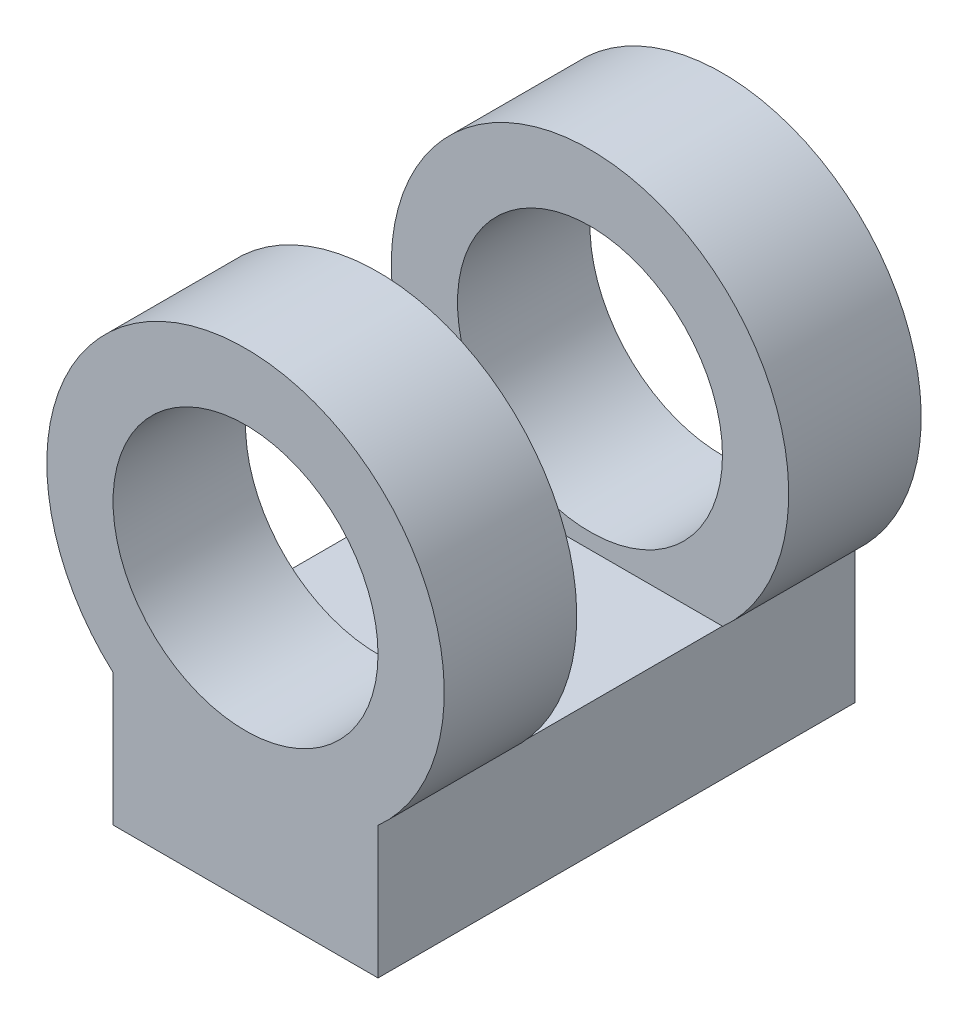
ISO-10303-21;
HEADER;
FILE_DESCRIPTION(('STEP AP214'),'2;1');
FILE_NAME('part.step','',(''),(''),'','','');
FILE_SCHEMA(('AUTOMOTIVE_DESIGN { 1 0 10303 214 1 1 1 1 }'));
ENDSEC;
DATA;
#1=APPLICATION_CONTEXT('core data for automotive mechanical design processes');
#2=APPLICATION_PROTOCOL_DEFINITION('international standard','automotive_design',2000,#1);
#3=PRODUCT_CONTEXT('',#1,'mechanical');
#4=PRODUCT('Part','Part','',(#3));
#5=PRODUCT_RELATED_PRODUCT_CATEGORY('part','',(#4));
#6=PRODUCT_DEFINITION_FORMATION('','',#4);
#7=PRODUCT_DEFINITION_CONTEXT('part definition',#1,'design');
#8=PRODUCT_DEFINITION('design','',#6,#7);
#9=PRODUCT_DEFINITION_SHAPE('','',#8);
#10=(LENGTH_UNIT() NAMED_UNIT(*) SI_UNIT(.MILLI.,.METRE.));
#11=(NAMED_UNIT(*) PLANE_ANGLE_UNIT() SI_UNIT($,.RADIAN.));
#12=(NAMED_UNIT(*) SI_UNIT($,.STERADIAN.) SOLID_ANGLE_UNIT());
#13=UNCERTAINTY_MEASURE_WITH_UNIT(LENGTH_MEASURE(1.E-05),#10,'distance_accuracy_value','');
#14=(GEOMETRIC_REPRESENTATION_CONTEXT(3) GLOBAL_UNCERTAINTY_ASSIGNED_CONTEXT((#13)) GLOBAL_UNIT_ASSIGNED_CONTEXT((#10,
#11,#12)) REPRESENTATION_CONTEXT('',''));
#15=CARTESIAN_POINT('',(0.,0.,0.));
#16=DIRECTION('',(0.,0.,1.));
#17=DIRECTION('',(1.,0.,0.));
#18=AXIS2_PLACEMENT_3D('',#15,#16,#17);
#19=CARTESIAN_POINT('',(0.,25.,0.));
#20=DIRECTION('',(0.,1.,0.));
#21=DIRECTION('',(0.,0.,1.));
#22=AXIS2_PLACEMENT_3D('',#19,#20,#21);
#23=PLANE('',#22);
#24=DIRECTION('',(1.,0.,0.));
#25=VECTOR('',#24,1.);
#26=CARTESIAN_POINT('',(0.,25.,-20.));
#27=LINE('',#26,#25);
#28=CARTESIAN_POINT('',(-25.,25.,-20.));
#29=VERTEX_POINT('',#28);
#30=CARTESIAN_POINT('',(25.,25.,-20.));
#31=VERTEX_POINT('',#30);
#32=EDGE_CURVE('E59',#29,#31,#27,.T.);
#33=ORIENTED_EDGE('',*,*,#32,.F.);
#34=DIRECTION('',(0.,0.,1.));
#35=VECTOR('',#34,1.);
#36=CARTESIAN_POINT('',(-25.,25.,-45.));
#37=LINE('',#36,#35);
#38=CARTESIAN_POINT('',(-25.,25.,20.));
#39=VERTEX_POINT('',#38);
#40=EDGE_CURVE('E148',#29,#39,#37,.T.);
#41=ORIENTED_EDGE('',*,*,#40,.T.);
#42=DIRECTION('',(1.,0.,0.));
#43=VECTOR('',#42,1.);
#44=CARTESIAN_POINT('',(0.,25.,20.));
#45=LINE('',#44,#43);
#46=CARTESIAN_POINT('',(25.,25.,20.));
#47=VERTEX_POINT('',#46);
#48=EDGE_CURVE('E170',#39,#47,#45,.T.);
#49=ORIENTED_EDGE('',*,*,#48,.T.);
#50=DIRECTION('',(0.,0.,1.));
#51=VECTOR('',#50,1.);
#52=CARTESIAN_POINT('',(25.,25.,-45.));
#53=LINE('',#52,#51);
#54=EDGE_CURVE('E150',#31,#47,#53,.T.);
#55=ORIENTED_EDGE('',*,*,#54,.F.);
#56=EDGE_LOOP('',(#33,#41,#49,#55));
#57=FACE_BOUND('',#56,.T.);
#58=ADVANCED_FACE('F36',(#57),#23,.T.);
#59=CARTESIAN_POINT('',(-25.,25.,-45.));
#60=DIRECTION('',(1.,0.,0.));
#61=DIRECTION('',(0.,0.,-1.));
#62=AXIS2_PLACEMENT_3D('',#59,#60,#61);
#63=PLANE('',#62);
#64=DIRECTION('',(0.,-1.,0.));
#65=VECTOR('',#64,1.);
#66=CARTESIAN_POINT('',(-25.,25.,-20.));
#67=LINE('',#66,#65);
#68=CARTESIAN_POINT('',(-25.,24.9491502812526,-20.));
#69=VERTEX_POINT('',#68);
#70=EDGE_CURVE('E51',#29,#69,#67,.T.);
#71=ORIENTED_EDGE('',*,*,#70,.T.);
#72=DIRECTION('',(0.,0.,1.));
#73=VECTOR('',#72,1.);
#74=CARTESIAN_POINT('',(-25.,24.9491502812526,-45.));
#75=LINE('',#74,#73);
#76=CARTESIAN_POINT('',(-25.,24.9491502812526,-45.));
#77=VERTEX_POINT('',#76);
#78=EDGE_CURVE('E109',#69,#77,#75,.F.);
#79=ORIENTED_EDGE('',*,*,#78,.T.);
#80=DIRECTION('',(0.,-1.,0.));
#81=VECTOR('',#80,1.);
#82=CARTESIAN_POINT('',(-25.,25.,-45.));
#83=LINE('',#82,#81);
#84=CARTESIAN_POINT('',(-25.,0.,-45.));
#85=VERTEX_POINT('',#84);
#86=EDGE_CURVE('E153',#77,#85,#83,.T.);
#87=ORIENTED_EDGE('',*,*,#86,.T.);
#88=DIRECTION('',(0.,0.,1.));
#89=VECTOR('',#88,1.);
#90=CARTESIAN_POINT('',(-25.,0.,-45.));
#91=LINE('',#90,#89);
#92=CARTESIAN_POINT('',(-25.,0.,45.));
#93=VERTEX_POINT('',#92);
#94=EDGE_CURVE('E147',#85,#93,#91,.T.);
#95=ORIENTED_EDGE('',*,*,#94,.T.);
#96=DIRECTION('',(0.,-1.,0.));
#97=VECTOR('',#96,1.);
#98=CARTESIAN_POINT('',(-25.,25.,45.));
#99=LINE('',#98,#97);
#100=CARTESIAN_POINT('',(-25.,24.9491502812526,45.));
#101=VERTEX_POINT('',#100);
#102=EDGE_CURVE('E168',#101,#93,#99,.T.);
#103=ORIENTED_EDGE('',*,*,#102,.F.);
#104=DIRECTION('',(0.,0.,1.));
#105=VECTOR('',#104,1.);
#106=CARTESIAN_POINT('',(-25.,24.9491502812526,20.));
#107=LINE('',#106,#105);
#108=CARTESIAN_POINT('',(-25.,24.9491502812526,20.));
#109=VERTEX_POINT('',#108);
#110=EDGE_CURVE('E145',#101,#109,#107,.F.);
#111=ORIENTED_EDGE('',*,*,#110,.T.);
#112=DIRECTION('',(0.,-1.,0.));
#113=VECTOR('',#112,1.);
#114=CARTESIAN_POINT('',(-25.,25.,20.));
#115=LINE('',#114,#113);
#116=EDGE_CURVE('E142',#39,#109,#115,.T.);
#117=ORIENTED_EDGE('',*,*,#116,.F.);
#118=ORIENTED_EDGE('',*,*,#40,.F.);
#119=EDGE_LOOP('',(#71,#79,#87,#95,#103,#111,#117,#118));
#120=FACE_BOUND('',#119,.T.);
#121=ADVANCED_FACE('F38',(#120),#63,.F.);
#122=CARTESIAN_POINT('',(-25.,25.,45.));
#123=DIRECTION('',(0.,0.,-1.));
#124=DIRECTION('',(-1.,0.,0.));
#125=AXIS2_PLACEMENT_3D('',#122,#123,#124);
#126=PLANE('',#125);
#127=CARTESIAN_POINT('',(0.,52.9,45.));
#128=DIRECTION('',(0.,0.,1.));
#129=DIRECTION('',(1.,0.,0.));
#130=AXIS2_PLACEMENT_3D('',#127,#128,#129);
#131=CIRCLE('',#130,25.);
#132=CARTESIAN_POINT('',(25.,52.9,45.));
#133=VERTEX_POINT('',#132);
#134=EDGE_CURVE('E128',#133,#133,#131,.T.);
#135=ORIENTED_EDGE('',*,*,#134,.F.);
#136=EDGE_LOOP('',(#135));
#137=FACE_BOUND('',#136,.T.);
#138=CARTESIAN_POINT('',(0.,52.9,45.));
#139=DIRECTION('',(0.,0.,1.));
#140=DIRECTION('',(1.,0.,0.));
#141=AXIS2_PLACEMENT_3D('',#138,#139,#140);
#142=CIRCLE('',#141,37.5);
#143=CARTESIAN_POINT('',(25.,24.9491502812526,45.));
#144=VERTEX_POINT('',#143);
#145=EDGE_CURVE('E132',#144,#101,#142,.T.);
#146=ORIENTED_EDGE('',*,*,#145,.T.);
#147=ORIENTED_EDGE('',*,*,#102,.T.);
#148=DIRECTION('',(1.,0.,0.));
#149=VECTOR('',#148,1.);
#150=CARTESIAN_POINT('',(-25.,0.,45.));
#151=LINE('',#150,#149);
#152=CARTESIAN_POINT('',(25.,0.,45.));
#153=VERTEX_POINT('',#152);
#154=EDGE_CURVE('E156',#93,#153,#151,.T.);
#155=ORIENTED_EDGE('',*,*,#154,.T.);
#156=DIRECTION('',(0.,-1.,0.));
#157=VECTOR('',#156,1.);
#158=CARTESIAN_POINT('',(25.,25.,45.));
#159=LINE('',#158,#157);
#160=EDGE_CURVE('E166',#144,#153,#159,.T.);
#161=ORIENTED_EDGE('',*,*,#160,.F.);
#162=EDGE_LOOP('',(#146,#147,#155,#161));
#163=FACE_BOUND('',#162,.T.);
#164=ADVANCED_FACE('F185',(#137,#163),#126,.F.);
#165=CARTESIAN_POINT('',(25.,25.,-45.));
#166=DIRECTION('',(1.,0.,0.));
#167=DIRECTION('',(0.,0.,-1.));
#168=AXIS2_PLACEMENT_3D('',#165,#166,#167);
#169=PLANE('',#168);
#170=DIRECTION('',(0.,0.,1.));
#171=VECTOR('',#170,1.);
#172=CARTESIAN_POINT('',(25.,24.9491502812526,-45.));
#173=LINE('',#172,#171);
#174=CARTESIAN_POINT('',(25.,24.9491502812526,-20.));
#175=VERTEX_POINT('',#174);
#176=CARTESIAN_POINT('',(25.,24.9491502812526,-45.));
#177=VERTEX_POINT('',#176);
#178=EDGE_CURVE('E101',#175,#177,#173,.F.);
#179=ORIENTED_EDGE('',*,*,#178,.F.);
#180=DIRECTION('',(0.,-1.,0.));
#181=VECTOR('',#180,1.);
#182=CARTESIAN_POINT('',(25.,25.,-20.));
#183=LINE('',#182,#181);
#184=EDGE_CURVE('E11',#31,#175,#183,.T.);
#185=ORIENTED_EDGE('',*,*,#184,.F.);
#186=ORIENTED_EDGE('',*,*,#54,.T.);
#187=DIRECTION('',(0.,-1.,0.));
#188=VECTOR('',#187,1.);
#189=CARTESIAN_POINT('',(25.,25.,20.));
#190=LINE('',#189,#188);
#191=CARTESIAN_POINT('',(25.,24.9491502812526,20.));
#192=VERTEX_POINT('',#191);
#193=EDGE_CURVE('E138',#47,#192,#190,.T.);
#194=ORIENTED_EDGE('',*,*,#193,.T.);
#195=DIRECTION('',(0.,0.,1.));
#196=VECTOR('',#195,1.);
#197=CARTESIAN_POINT('',(25.,24.9491502812526,20.));
#198=LINE('',#197,#196);
#199=EDGE_CURVE('E44',#144,#192,#198,.F.);
#200=ORIENTED_EDGE('',*,*,#199,.F.);
#201=ORIENTED_EDGE('',*,*,#160,.T.);
#202=DIRECTION('',(0.,0.,1.));
#203=VECTOR('',#202,1.);
#204=CARTESIAN_POINT('',(25.,0.,-45.));
#205=LINE('',#204,#203);
#206=CARTESIAN_POINT('',(25.,0.,-45.));
#207=VERTEX_POINT('',#206);
#208=EDGE_CURVE('E159',#207,#153,#205,.T.);
#209=ORIENTED_EDGE('',*,*,#208,.F.);
#210=DIRECTION('',(0.,-1.,0.));
#211=VECTOR('',#210,1.);
#212=CARTESIAN_POINT('',(25.,25.,-45.));
#213=LINE('',#212,#211);
#214=EDGE_CURVE('E104',#177,#207,#213,.T.);
#215=ORIENTED_EDGE('',*,*,#214,.F.);
#216=EDGE_LOOP('',(#179,#185,#186,#194,#200,#201,#209,#215));
#217=FACE_BOUND('',#216,.T.);
#218=ADVANCED_FACE('F102',(#217),#169,.T.);
#219=CARTESIAN_POINT('',(-25.,25.,-45.));
#220=DIRECTION('',(0.,0.,-1.));
#221=DIRECTION('',(-1.,0.,0.));
#222=AXIS2_PLACEMENT_3D('',#219,#220,#221);
#223=PLANE('',#222);
#224=CARTESIAN_POINT('',(0.,52.9,-45.));
#225=DIRECTION('',(0.,0.,1.));
#226=DIRECTION('',(1.,0.,0.));
#227=AXIS2_PLACEMENT_3D('',#224,#225,#226);
#228=CIRCLE('',#227,25.);
#229=CARTESIAN_POINT('',(25.,52.9,-45.));
#230=VERTEX_POINT('',#229);
#231=EDGE_CURVE('E117',#230,#230,#228,.T.);
#232=ORIENTED_EDGE('',*,*,#231,.T.);
#233=EDGE_LOOP('',(#232));
#234=FACE_BOUND('',#233,.T.);
#235=ORIENTED_EDGE('',*,*,#86,.F.);
#236=CARTESIAN_POINT('',(0.,52.9,-45.));
#237=DIRECTION('',(0.,0.,1.));
#238=DIRECTION('',(1.,0.,0.));
#239=AXIS2_PLACEMENT_3D('',#236,#237,#238);
#240=CIRCLE('',#239,37.5);
#241=EDGE_CURVE('E110',#177,#77,#240,.T.);
#242=ORIENTED_EDGE('',*,*,#241,.F.);
#243=ORIENTED_EDGE('',*,*,#214,.T.);
#244=DIRECTION('',(1.,0.,0.));
#245=VECTOR('',#244,1.);
#246=CARTESIAN_POINT('',(-25.,0.,-45.));
#247=LINE('',#246,#245);
#248=EDGE_CURVE('E151',#85,#207,#247,.T.);
#249=ORIENTED_EDGE('',*,*,#248,.F.);
#250=EDGE_LOOP('',(#235,#242,#243,#249));
#251=FACE_BOUND('',#250,.T.);
#252=ADVANCED_FACE('F193',(#234,#251),#223,.T.);
#253=CARTESIAN_POINT('',(0.,0.,0.));
#254=DIRECTION('',(0.,1.,0.));
#255=DIRECTION('',(0.,0.,1.));
#256=AXIS2_PLACEMENT_3D('',#253,#254,#255);
#257=PLANE('',#256);
#258=ORIENTED_EDGE('',*,*,#94,.F.);
#259=ORIENTED_EDGE('',*,*,#248,.T.);
#260=ORIENTED_EDGE('',*,*,#208,.T.);
#261=ORIENTED_EDGE('',*,*,#154,.F.);
#262=EDGE_LOOP('',(#258,#259,#260,#261));
#263=FACE_BOUND('',#262,.T.);
#264=ADVANCED_FACE('F190',(#263),#257,.F.);
#265=CARTESIAN_POINT('',(0.,52.9,20.));
#266=DIRECTION('',(0.,0.,1.));
#267=DIRECTION('',(1.,0.,0.));
#268=AXIS2_PLACEMENT_3D('',#265,#266,#267);
#269=CYLINDRICAL_SURFACE('',#268,37.5);
#270=ORIENTED_EDGE('',*,*,#110,.F.);
#271=ORIENTED_EDGE('',*,*,#145,.F.);
#272=ORIENTED_EDGE('',*,*,#199,.T.);
#273=CARTESIAN_POINT('',(0.,52.9,20.));
#274=DIRECTION('',(0.,0.,1.));
#275=DIRECTION('',(1.,0.,0.));
#276=AXIS2_PLACEMENT_3D('',#273,#274,#275);
#277=CIRCLE('',#276,37.5);
#278=EDGE_CURVE('E135',#192,#109,#277,.T.);
#279=ORIENTED_EDGE('',*,*,#278,.T.);
#280=EDGE_LOOP('',(#270,#271,#272,#279));
#281=FACE_BOUND('',#280,.T.);
#282=ADVANCED_FACE('F177',(#281),#269,.T.);
#283=CARTESIAN_POINT('',(0.,52.9,20.));
#284=DIRECTION('',(0.,0.,1.));
#285=DIRECTION('',(1.,0.,0.));
#286=AXIS2_PLACEMENT_3D('',#283,#284,#285);
#287=PLANE('',#286);
#288=CARTESIAN_POINT('',(0.,52.9,20.));
#289=DIRECTION('',(0.,0.,1.));
#290=DIRECTION('',(1.,0.,0.));
#291=AXIS2_PLACEMENT_3D('',#288,#289,#290);
#292=CIRCLE('',#291,25.);
#293=CARTESIAN_POINT('',(25.,52.9,20.));
#294=VERTEX_POINT('',#293);
#295=EDGE_CURVE('E129',#294,#294,#292,.T.);
#296=ORIENTED_EDGE('',*,*,#295,.T.);
#297=EDGE_LOOP('',(#296));
#298=FACE_BOUND('',#297,.T.);
#299=ORIENTED_EDGE('',*,*,#48,.F.);
#300=ORIENTED_EDGE('',*,*,#116,.T.);
#301=ORIENTED_EDGE('',*,*,#278,.F.);
#302=ORIENTED_EDGE('',*,*,#193,.F.);
#303=EDGE_LOOP('',(#299,#300,#301,#302));
#304=FACE_BOUND('',#303,.T.);
#305=ADVANCED_FACE('F182',(#298,#304),#287,.F.);
#306=CARTESIAN_POINT('',(0.,52.9,20.));
#307=DIRECTION('',(0.,0.,1.));
#308=DIRECTION('',(1.,0.,0.));
#309=AXIS2_PLACEMENT_3D('',#306,#307,#308);
#310=CYLINDRICAL_SURFACE('',#309,25.);
#311=ORIENTED_EDGE('',*,*,#295,.F.);
#312=EDGE_LOOP('',(#311));
#313=FACE_BOUND('',#312,.T.);
#314=ORIENTED_EDGE('',*,*,#134,.T.);
#315=EDGE_LOOP('',(#314));
#316=FACE_BOUND('',#315,.T.);
#317=ADVANCED_FACE('F213',(#313,#316),#310,.F.);
#318=CARTESIAN_POINT('',(0.,52.9,-20.));
#319=DIRECTION('',(0.,0.,1.));
#320=DIRECTION('',(1.,0.,0.));
#321=AXIS2_PLACEMENT_3D('',#318,#319,#320);
#322=PLANE('',#321);
#323=CARTESIAN_POINT('',(0.,52.9,-20.));
#324=DIRECTION('',(0.,0.,1.));
#325=DIRECTION('',(1.,0.,0.));
#326=AXIS2_PLACEMENT_3D('',#323,#324,#325);
#327=CIRCLE('',#326,25.);
#328=CARTESIAN_POINT('',(25.,52.9,-20.));
#329=VERTEX_POINT('',#328);
#330=EDGE_CURVE('E121',#329,#329,#327,.T.);
#331=ORIENTED_EDGE('',*,*,#330,.F.);
#332=EDGE_LOOP('',(#331));
#333=FACE_BOUND('',#332,.T.);
#334=ORIENTED_EDGE('',*,*,#70,.F.);
#335=ORIENTED_EDGE('',*,*,#32,.T.);
#336=ORIENTED_EDGE('',*,*,#184,.T.);
#337=CARTESIAN_POINT('',(0.,52.9,-20.));
#338=DIRECTION('',(0.,0.,1.));
#339=DIRECTION('',(1.,0.,0.));
#340=AXIS2_PLACEMENT_3D('',#337,#338,#339);
#341=CIRCLE('',#340,37.5);
#342=EDGE_CURVE('E115',#175,#69,#341,.T.);
#343=ORIENTED_EDGE('',*,*,#342,.T.);
#344=EDGE_LOOP('',(#334,#335,#336,#343));
#345=FACE_BOUND('',#344,.T.);
#346=ADVANCED_FACE('F114',(#333,#345),#322,.T.);
#347=CARTESIAN_POINT('',(0.,52.9,-45.));
#348=DIRECTION('',(0.,0.,1.));
#349=DIRECTION('',(1.,0.,0.));
#350=AXIS2_PLACEMENT_3D('',#347,#348,#349);
#351=CYLINDRICAL_SURFACE('',#350,37.5);
#352=ORIENTED_EDGE('',*,*,#78,.F.);
#353=ORIENTED_EDGE('',*,*,#342,.F.);
#354=ORIENTED_EDGE('',*,*,#178,.T.);
#355=ORIENTED_EDGE('',*,*,#241,.T.);
#356=EDGE_LOOP('',(#352,#353,#354,#355));
#357=FACE_BOUND('',#356,.T.);
#358=ADVANCED_FACE('F116',(#357),#351,.T.);
#359=CARTESIAN_POINT('',(0.,52.9,-45.));
#360=DIRECTION('',(0.,0.,1.));
#361=DIRECTION('',(1.,0.,0.));
#362=AXIS2_PLACEMENT_3D('',#359,#360,#361);
#363=CYLINDRICAL_SURFACE('',#362,25.);
#364=ORIENTED_EDGE('',*,*,#231,.F.);
#365=EDGE_LOOP('',(#364));
#366=FACE_BOUND('',#365,.T.);
#367=ORIENTED_EDGE('',*,*,#330,.T.);
#368=EDGE_LOOP('',(#367));
#369=FACE_BOUND('',#368,.T.);
#370=ADVANCED_FACE('F220',(#366,#369),#363,.F.);
#371=CLOSED_SHELL('',(#58,#121,#164,#218,#252,#264,#282,#305,#317,#346,#358,#370));
#372=MANIFOLD_SOLID_BREP('B2',#371);
#373=ADVANCED_BREP_SHAPE_REPRESENTATION('',(#18,#372),#14);
#374=SHAPE_DEFINITION_REPRESENTATION(#9,#373);
ENDSEC;
END-ISO-10303-21;
